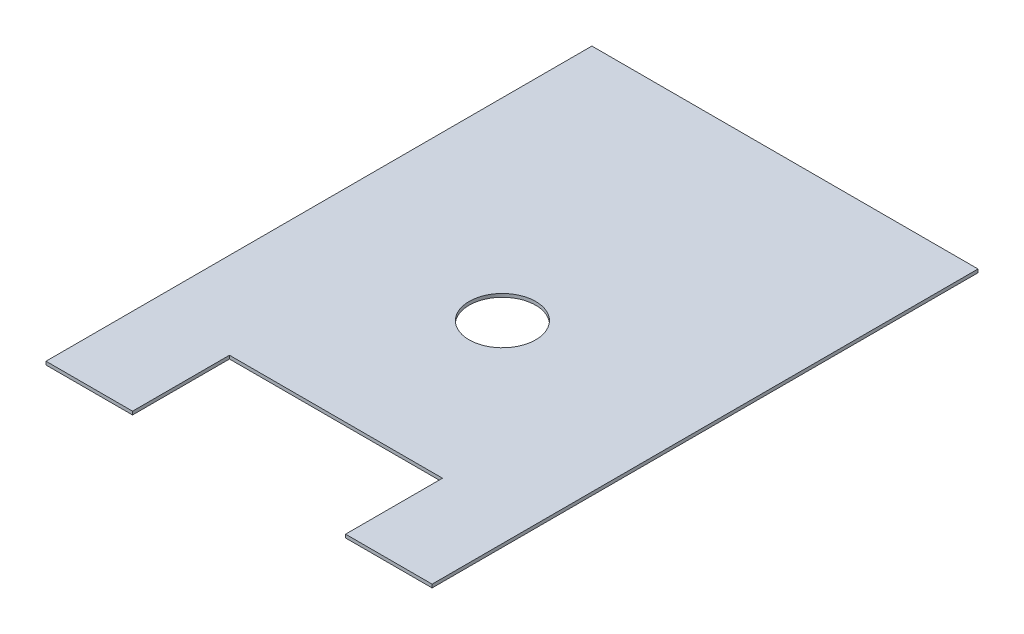
ISO-10303-21;
HEADER;
FILE_DESCRIPTION(('STEP AP214'),'2;1');
FILE_NAME('part.step','',(''),(''),'','','');
FILE_SCHEMA(('AUTOMOTIVE_DESIGN { 1 0 10303 214 1 1 1 1 }'));
ENDSEC;
DATA;
#1=APPLICATION_CONTEXT('core data for automotive mechanical design processes');
#2=APPLICATION_PROTOCOL_DEFINITION('international standard','automotive_design',2000,#1);
#3=PRODUCT_CONTEXT('',#1,'mechanical');
#4=PRODUCT('Part','Part','',(#3));
#5=PRODUCT_RELATED_PRODUCT_CATEGORY('part','',(#4));
#6=PRODUCT_DEFINITION_FORMATION('','',#4);
#7=PRODUCT_DEFINITION_CONTEXT('part definition',#1,'design');
#8=PRODUCT_DEFINITION('design','',#6,#7);
#9=PRODUCT_DEFINITION_SHAPE('','',#8);
#10=(LENGTH_UNIT() NAMED_UNIT(*) SI_UNIT(.MILLI.,.METRE.));
#11=(NAMED_UNIT(*) PLANE_ANGLE_UNIT() SI_UNIT($,.RADIAN.));
#12=(NAMED_UNIT(*) SI_UNIT($,.STERADIAN.) SOLID_ANGLE_UNIT());
#13=UNCERTAINTY_MEASURE_WITH_UNIT(LENGTH_MEASURE(1.E-05),#10,'distance_accuracy_value','');
#14=(GEOMETRIC_REPRESENTATION_CONTEXT(3) GLOBAL_UNCERTAINTY_ASSIGNED_CONTEXT((#13)) GLOBAL_UNIT_ASSIGNED_CONTEXT((#10,
#11,#12)) REPRESENTATION_CONTEXT('',''));
#15=CARTESIAN_POINT('',(0.,0.,0.));
#16=DIRECTION('',(0.,0.,1.));
#17=DIRECTION('',(1.,0.,0.));
#18=AXIS2_PLACEMENT_3D('',#15,#16,#17);
#19=CARTESIAN_POINT('',(-184.15,-3.175,260.35));
#20=DIRECTION('',(0.,0.,1.));
#21=DIRECTION('',(1.,0.,0.));
#22=AXIS2_PLACEMENT_3D('',#19,#20,#21);
#23=PLANE('',#22);
#24=DIRECTION('',(0.,1.,0.));
#25=VECTOR('',#24,1.);
#26=CARTESIAN_POINT('',(101.6,-3.175,260.35));
#27=LINE('',#26,#25);
#28=CARTESIAN_POINT('',(101.6,-3.175,260.35));
#29=VERTEX_POINT('',#28);
#30=CARTESIAN_POINT('',(101.6,0.,260.35));
#31=VERTEX_POINT('',#30);
#32=EDGE_CURVE('E150',#29,#31,#27,.T.);
#33=ORIENTED_EDGE('',*,*,#32,.F.);
#34=DIRECTION('',(1.,0.,0.));
#35=VECTOR('',#34,1.);
#36=CARTESIAN_POINT('',(-184.15,-3.175,260.35));
#37=LINE('',#36,#35);
#38=CARTESIAN_POINT('',(184.15,-3.175,260.35));
#39=VERTEX_POINT('',#38);
#40=EDGE_CURVE('E69',#29,#39,#37,.T.);
#41=ORIENTED_EDGE('',*,*,#40,.T.);
#42=DIRECTION('',(0.,1.,0.));
#43=VECTOR('',#42,1.);
#44=CARTESIAN_POINT('',(184.15,-3.175,260.35));
#45=LINE('',#44,#43);
#46=CARTESIAN_POINT('',(184.15,0.,260.35));
#47=VERTEX_POINT('',#46);
#48=EDGE_CURVE('E53',#39,#47,#45,.T.);
#49=ORIENTED_EDGE('',*,*,#48,.T.);
#50=DIRECTION('',(1.,0.,0.));
#51=VECTOR('',#50,1.);
#52=CARTESIAN_POINT('',(-184.15,0.,260.35));
#53=LINE('',#52,#51);
#54=EDGE_CURVE('E91',#31,#47,#53,.T.);
#55=ORIENTED_EDGE('',*,*,#54,.F.);
#56=EDGE_LOOP('',(#33,#41,#49,#55));
#57=FACE_BOUND('',#56,.T.);
#58=ADVANCED_FACE('F45',(#57),#23,.T.);
#59=CARTESIAN_POINT('',(184.15,-3.175,260.35));
#60=DIRECTION('',(1.,0.,0.));
#61=DIRECTION('',(0.,0.,-1.));
#62=AXIS2_PLACEMENT_3D('',#59,#60,#61);
#63=PLANE('',#62);
#64=DIRECTION('',(0.,0.,-1.));
#65=VECTOR('',#64,1.);
#66=CARTESIAN_POINT('',(184.15,0.,260.35));
#67=LINE('',#66,#65);
#68=CARTESIAN_POINT('',(184.15,0.,-260.35));
#69=VERTEX_POINT('',#68);
#70=EDGE_CURVE('E152',#47,#69,#67,.T.);
#71=ORIENTED_EDGE('',*,*,#70,.F.);
#72=ORIENTED_EDGE('',*,*,#48,.F.);
#73=DIRECTION('',(0.,0.,-1.));
#74=VECTOR('',#73,1.);
#75=CARTESIAN_POINT('',(184.15,-3.175,260.35));
#76=LINE('',#75,#74);
#77=CARTESIAN_POINT('',(184.15,-3.175,-260.35));
#78=VERTEX_POINT('',#77);
#79=EDGE_CURVE('E153',#39,#78,#76,.T.);
#80=ORIENTED_EDGE('',*,*,#79,.T.);
#81=DIRECTION('',(0.,1.,0.));
#82=VECTOR('',#81,1.);
#83=CARTESIAN_POINT('',(184.15,-3.175,-260.35));
#84=LINE('',#83,#82);
#85=EDGE_CURVE('E97',#78,#69,#84,.T.);
#86=ORIENTED_EDGE('',*,*,#85,.T.);
#87=EDGE_LOOP('',(#71,#72,#80,#86));
#88=FACE_BOUND('',#87,.T.);
#89=ADVANCED_FACE('F47',(#88),#63,.T.);
#90=DIRECTION('',(0.,-1.,0.));
#91=VECTOR('',#90,1.);
#92=CARTESIAN_POINT('',(-101.6,-3.175,260.35));
#93=LINE('',#92,#91);
#94=CARTESIAN_POINT('',(-101.6,0.,260.35));
#95=VERTEX_POINT('',#94);
#96=CARTESIAN_POINT('',(-101.6,-3.175,260.35));
#97=VERTEX_POINT('',#96);
#98=EDGE_CURVE('E147',#95,#97,#93,.T.);
#99=ORIENTED_EDGE('',*,*,#98,.F.);
#100=CARTESIAN_POINT('',(-184.15,0.,260.35));
#101=VERTEX_POINT('',#100);
#102=EDGE_CURVE('E157',#101,#95,#53,.T.);
#103=ORIENTED_EDGE('',*,*,#102,.F.);
#104=DIRECTION('',(0.,1.,0.));
#105=VECTOR('',#104,1.);
#106=CARTESIAN_POINT('',(-184.15,-3.175,260.35));
#107=LINE('',#106,#105);
#108=CARTESIAN_POINT('',(-184.15,-3.175,260.35));
#109=VERTEX_POINT('',#108);
#110=EDGE_CURVE('E175',#109,#101,#107,.T.);
#111=ORIENTED_EDGE('',*,*,#110,.F.);
#112=EDGE_CURVE('E162',#109,#97,#37,.T.);
#113=ORIENTED_EDGE('',*,*,#112,.T.);
#114=EDGE_LOOP('',(#99,#103,#111,#113));
#115=FACE_BOUND('',#114,.T.);
#116=ADVANCED_FACE('F199',(#115),#23,.T.);
#117=CARTESIAN_POINT('',(-184.15,-3.175,260.35));
#118=DIRECTION('',(-1.,0.,0.));
#119=DIRECTION('',(0.,0.,1.));
#120=AXIS2_PLACEMENT_3D('',#117,#118,#119);
#121=PLANE('',#120);
#122=DIRECTION('',(0.,0.,1.));
#123=VECTOR('',#122,1.);
#124=CARTESIAN_POINT('',(-184.15,0.,260.35));
#125=LINE('',#124,#123);
#126=CARTESIAN_POINT('',(-184.15,0.,-260.35));
#127=VERTEX_POINT('',#126);
#128=EDGE_CURVE('E169',#127,#101,#125,.T.);
#129=ORIENTED_EDGE('',*,*,#128,.F.);
#130=DIRECTION('',(0.,1.,0.));
#131=VECTOR('',#130,1.);
#132=CARTESIAN_POINT('',(-184.15,-3.175,-260.35));
#133=LINE('',#132,#131);
#134=CARTESIAN_POINT('',(-184.15,-3.175,-260.35));
#135=VERTEX_POINT('',#134);
#136=EDGE_CURVE('E177',#135,#127,#133,.T.);
#137=ORIENTED_EDGE('',*,*,#136,.F.);
#138=DIRECTION('',(0.,0.,1.));
#139=VECTOR('',#138,1.);
#140=CARTESIAN_POINT('',(-184.15,-3.175,260.35));
#141=LINE('',#140,#139);
#142=EDGE_CURVE('E159',#135,#109,#141,.T.);
#143=ORIENTED_EDGE('',*,*,#142,.T.);
#144=ORIENTED_EDGE('',*,*,#110,.T.);
#145=EDGE_LOOP('',(#129,#137,#143,#144));
#146=FACE_BOUND('',#145,.T.);
#147=ADVANCED_FACE('F206',(#146),#121,.T.);
#148=CARTESIAN_POINT('',(-184.15,-3.175,-260.35));
#149=DIRECTION('',(0.,0.,-1.));
#150=DIRECTION('',(-1.,0.,0.));
#151=AXIS2_PLACEMENT_3D('',#148,#149,#150);
#152=PLANE('',#151);
#153=DIRECTION('',(-1.,0.,0.));
#154=VECTOR('',#153,1.);
#155=CARTESIAN_POINT('',(-184.15,0.,-260.35));
#156=LINE('',#155,#154);
#157=EDGE_CURVE('E166',#69,#127,#156,.T.);
#158=ORIENTED_EDGE('',*,*,#157,.F.);
#159=ORIENTED_EDGE('',*,*,#85,.F.);
#160=DIRECTION('',(-1.,0.,0.));
#161=VECTOR('',#160,1.);
#162=CARTESIAN_POINT('',(-184.15,-3.175,-260.35));
#163=LINE('',#162,#161);
#164=EDGE_CURVE('E156',#78,#135,#163,.T.);
#165=ORIENTED_EDGE('',*,*,#164,.T.);
#166=ORIENTED_EDGE('',*,*,#136,.T.);
#167=EDGE_LOOP('',(#158,#159,#165,#166));
#168=FACE_BOUND('',#167,.T.);
#169=ADVANCED_FACE('F180',(#168),#152,.T.);
#170=CARTESIAN_POINT('',(0.,-3.175,0.));
#171=DIRECTION('',(0.,-1.,0.));
#172=DIRECTION('',(0.,0.,-1.));
#173=AXIS2_PLACEMENT_3D('',#170,#171,#172);
#174=PLANE('',#173);
#175=CARTESIAN_POINT('',(0.,-3.175,9.14399999999993));
#176=DIRECTION('',(0.,1.,0.));
#177=DIRECTION('',(0.,0.,1.));
#178=AXIS2_PLACEMENT_3D('',#175,#176,#177);
#179=CIRCLE('',#178,31.75);
#180=CARTESIAN_POINT('',(0.,-3.175,40.8939999999999));
#181=VERTEX_POINT('',#180);
#182=EDGE_CURVE('E145',#181,#181,#179,.T.);
#183=ORIENTED_EDGE('',*,*,#182,.T.);
#184=EDGE_LOOP('',(#183));
#185=FACE_BOUND('',#184,.T.);
#186=DIRECTION('',(0.,0.,-1.));
#187=VECTOR('',#186,1.);
#188=CARTESIAN_POINT('',(101.6,-3.175,352.806));
#189=LINE('',#188,#187);
#190=CARTESIAN_POINT('',(101.6,-3.175,167.894));
#191=VERTEX_POINT('',#190);
#192=EDGE_CURVE('E122',#29,#191,#189,.T.);
#193=ORIENTED_EDGE('',*,*,#192,.T.);
#194=DIRECTION('',(-1.,0.,0.));
#195=VECTOR('',#194,1.);
#196=CARTESIAN_POINT('',(-101.6,-3.175,167.894));
#197=LINE('',#196,#195);
#198=CARTESIAN_POINT('',(-101.6,-3.175,167.894));
#199=VERTEX_POINT('',#198);
#200=EDGE_CURVE('E128',#191,#199,#197,.T.);
#201=ORIENTED_EDGE('',*,*,#200,.T.);
#202=DIRECTION('',(0.,0.,1.));
#203=VECTOR('',#202,1.);
#204=CARTESIAN_POINT('',(-101.6,-3.175,352.806));
#205=LINE('',#204,#203);
#206=EDGE_CURVE('E125',#199,#97,#205,.T.);
#207=ORIENTED_EDGE('',*,*,#206,.T.);
#208=ORIENTED_EDGE('',*,*,#112,.F.);
#209=ORIENTED_EDGE('',*,*,#142,.F.);
#210=ORIENTED_EDGE('',*,*,#164,.F.);
#211=ORIENTED_EDGE('',*,*,#79,.F.);
#212=ORIENTED_EDGE('',*,*,#40,.F.);
#213=EDGE_LOOP('',(#193,#201,#207,#208,#209,#210,#211,#212));
#214=FACE_BOUND('',#213,.T.);
#215=ADVANCED_FACE('F134',(#185,#214),#174,.T.);
#216=CARTESIAN_POINT('',(0.,0.,0.));
#217=DIRECTION('',(0.,-1.,0.));
#218=DIRECTION('',(0.,0.,-1.));
#219=AXIS2_PLACEMENT_3D('',#216,#217,#218);
#220=PLANE('',#219);
#221=CARTESIAN_POINT('',(0.,0.,9.14399999999993));
#222=DIRECTION('',(0.,1.,0.));
#223=DIRECTION('',(0.,0.,1.));
#224=AXIS2_PLACEMENT_3D('',#221,#222,#223);
#225=CIRCLE('',#224,31.75);
#226=CARTESIAN_POINT('',(0.,0.,40.8939999999999));
#227=VERTEX_POINT('',#226);
#228=EDGE_CURVE('E141',#227,#227,#225,.T.);
#229=ORIENTED_EDGE('',*,*,#228,.F.);
#230=EDGE_LOOP('',(#229));
#231=FACE_BOUND('',#230,.T.);
#232=DIRECTION('',(-1.,0.,0.));
#233=VECTOR('',#232,1.);
#234=CARTESIAN_POINT('',(-101.6,0.,167.894));
#235=LINE('',#234,#233);
#236=CARTESIAN_POINT('',(101.6,0.,167.894));
#237=VERTEX_POINT('',#236);
#238=CARTESIAN_POINT('',(-101.6,0.,167.894));
#239=VERTEX_POINT('',#238);
#240=EDGE_CURVE('E138',#237,#239,#235,.T.);
#241=ORIENTED_EDGE('',*,*,#240,.F.);
#242=DIRECTION('',(0.,0.,1.));
#243=VECTOR('',#242,1.);
#244=CARTESIAN_POINT('',(101.6,0.,0.));
#245=LINE('',#244,#243);
#246=EDGE_CURVE('E11',#237,#31,#245,.T.);
#247=ORIENTED_EDGE('',*,*,#246,.T.);
#248=ORIENTED_EDGE('',*,*,#54,.T.);
#249=ORIENTED_EDGE('',*,*,#70,.T.);
#250=ORIENTED_EDGE('',*,*,#157,.T.);
#251=ORIENTED_EDGE('',*,*,#128,.T.);
#252=ORIENTED_EDGE('',*,*,#102,.T.);
#253=DIRECTION('',(0.,0.,1.));
#254=VECTOR('',#253,1.);
#255=CARTESIAN_POINT('',(-101.6,0.,352.806));
#256=LINE('',#255,#254);
#257=EDGE_CURVE('E136',#239,#95,#256,.T.);
#258=ORIENTED_EDGE('',*,*,#257,.F.);
#259=EDGE_LOOP('',(#241,#247,#248,#249,#250,#251,#252,#258));
#260=FACE_BOUND('',#259,.T.);
#261=ADVANCED_FACE('F182',(#231,#260),#220,.F.);
#262=CARTESIAN_POINT('',(101.6,-3.175,352.806));
#263=DIRECTION('',(1.,0.,0.));
#264=DIRECTION('',(0.,0.,-1.));
#265=AXIS2_PLACEMENT_3D('',#262,#263,#264);
#266=PLANE('',#265);
#267=ORIENTED_EDGE('',*,*,#32,.T.);
#268=ORIENTED_EDGE('',*,*,#246,.F.);
#269=DIRECTION('',(0.,1.,0.));
#270=VECTOR('',#269,1.);
#271=CARTESIAN_POINT('',(101.6,-3.175,167.894));
#272=LINE('',#271,#270);
#273=EDGE_CURVE('E60',#191,#237,#272,.T.);
#274=ORIENTED_EDGE('',*,*,#273,.F.);
#275=ORIENTED_EDGE('',*,*,#192,.F.);
#276=EDGE_LOOP('',(#267,#268,#274,#275));
#277=FACE_BOUND('',#276,.T.);
#278=ADVANCED_FACE('F120',(#277),#266,.F.);
#279=CARTESIAN_POINT('',(-101.6,-3.175,352.806));
#280=DIRECTION('',(-1.,0.,0.));
#281=DIRECTION('',(0.,0.,1.));
#282=AXIS2_PLACEMENT_3D('',#279,#280,#281);
#283=PLANE('',#282);
#284=ORIENTED_EDGE('',*,*,#98,.T.);
#285=ORIENTED_EDGE('',*,*,#206,.F.);
#286=DIRECTION('',(0.,1.,0.));
#287=VECTOR('',#286,1.);
#288=CARTESIAN_POINT('',(-101.6,-3.175,167.894));
#289=LINE('',#288,#287);
#290=EDGE_CURVE('E124',#199,#239,#289,.T.);
#291=ORIENTED_EDGE('',*,*,#290,.T.);
#292=ORIENTED_EDGE('',*,*,#257,.T.);
#293=EDGE_LOOP('',(#284,#285,#291,#292));
#294=FACE_BOUND('',#293,.T.);
#295=ADVANCED_FACE('F192',(#294),#283,.F.);
#296=CARTESIAN_POINT('',(-101.6,-3.175,167.894));
#297=DIRECTION('',(0.,0.,-1.));
#298=DIRECTION('',(-1.,0.,0.));
#299=AXIS2_PLACEMENT_3D('',#296,#297,#298);
#300=PLANE('',#299);
#301=ORIENTED_EDGE('',*,*,#240,.T.);
#302=ORIENTED_EDGE('',*,*,#290,.F.);
#303=ORIENTED_EDGE('',*,*,#200,.F.);
#304=ORIENTED_EDGE('',*,*,#273,.T.);
#305=EDGE_LOOP('',(#301,#302,#303,#304));
#306=FACE_BOUND('',#305,.T.);
#307=ADVANCED_FACE('F129',(#306),#300,.F.);
#308=CARTESIAN_POINT('',(0.,-3.175,9.14399999999993));
#309=DIRECTION('',(0.,1.,0.));
#310=DIRECTION('',(0.,0.,1.));
#311=AXIS2_PLACEMENT_3D('',#308,#309,#310);
#312=CYLINDRICAL_SURFACE('',#311,31.75);
#313=ORIENTED_EDGE('',*,*,#182,.F.);
#314=EDGE_LOOP('',(#313));
#315=FACE_BOUND('',#314,.T.);
#316=ORIENTED_EDGE('',*,*,#228,.T.);
#317=EDGE_LOOP('',(#316));
#318=FACE_BOUND('',#317,.T.);
#319=ADVANCED_FACE('F222',(#315,#318),#312,.F.);
#320=CLOSED_SHELL('',(#58,#89,#116,#147,#169,#215,#261,#278,#295,#307,#319));
#321=MANIFOLD_SOLID_BREP('B2',#320);
#322=ADVANCED_BREP_SHAPE_REPRESENTATION('',(#18,#321),#14);
#323=SHAPE_DEFINITION_REPRESENTATION(#9,#322);
ENDSEC;
END-ISO-10303-21;
